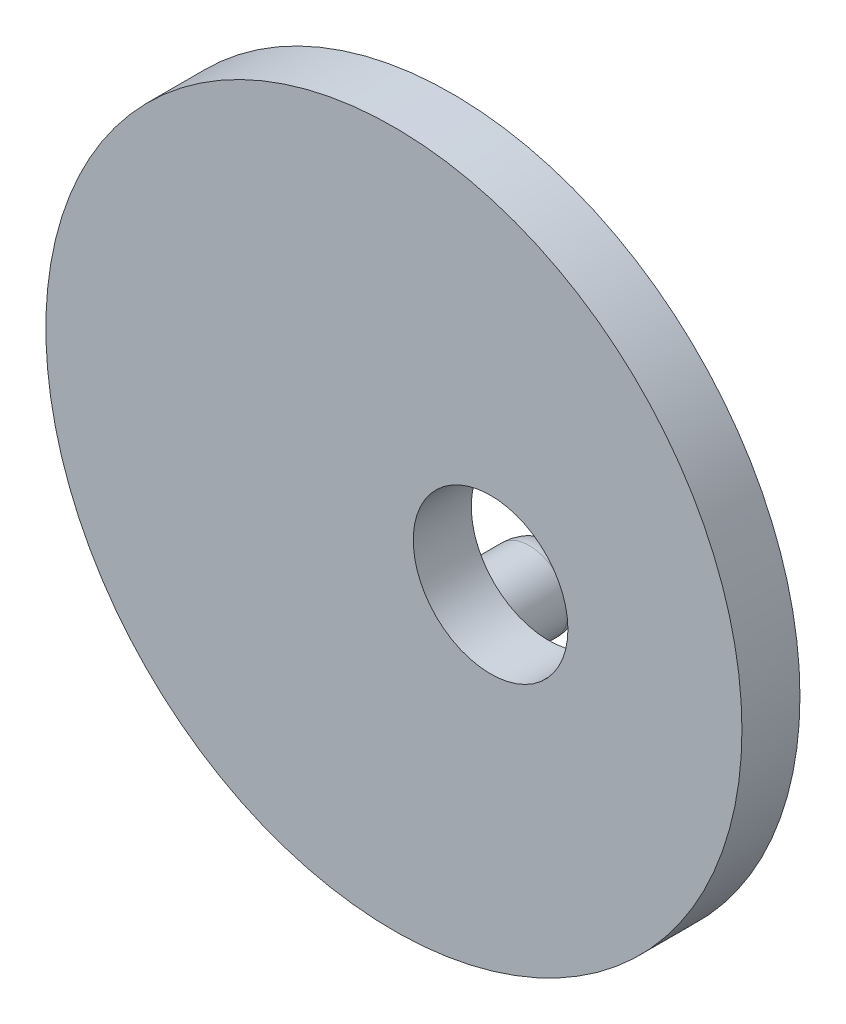
ISO-10303-21;
HEADER;
FILE_DESCRIPTION(('STEP AP214'),'2;1');
FILE_NAME('part.step','',(''),(''),'','','');
FILE_SCHEMA(('AUTOMOTIVE_DESIGN { 1 0 10303 214 1 1 1 1 }'));
ENDSEC;
DATA;
#1=APPLICATION_CONTEXT('core data for automotive mechanical design processes');
#2=APPLICATION_PROTOCOL_DEFINITION('international standard','automotive_design',2000,#1);
#3=PRODUCT_CONTEXT('',#1,'mechanical');
#4=PRODUCT('Part','Part','',(#3));
#5=PRODUCT_RELATED_PRODUCT_CATEGORY('part','',(#4));
#6=PRODUCT_DEFINITION_FORMATION('','',#4);
#7=PRODUCT_DEFINITION_CONTEXT('part definition',#1,'design');
#8=PRODUCT_DEFINITION('design','',#6,#7);
#9=PRODUCT_DEFINITION_SHAPE('','',#8);
#10=(LENGTH_UNIT() NAMED_UNIT(*) SI_UNIT(.MILLI.,.METRE.));
#11=(NAMED_UNIT(*) PLANE_ANGLE_UNIT() SI_UNIT($,.RADIAN.));
#12=(NAMED_UNIT(*) SI_UNIT($,.STERADIAN.) SOLID_ANGLE_UNIT());
#13=UNCERTAINTY_MEASURE_WITH_UNIT(LENGTH_MEASURE(1.E-05),#10,'distance_accuracy_value','');
#14=(GEOMETRIC_REPRESENTATION_CONTEXT(3) GLOBAL_UNCERTAINTY_ASSIGNED_CONTEXT((#13)) GLOBAL_UNIT_ASSIGNED_CONTEXT((#10,
#11,#12)) REPRESENTATION_CONTEXT('',''));
#15=CARTESIAN_POINT('',(0.,0.,0.));
#16=DIRECTION('',(0.,0.,1.));
#17=DIRECTION('',(1.,0.,0.));
#18=AXIS2_PLACEMENT_3D('',#15,#16,#17);
#19=CARTESIAN_POINT('',(2.5,0.,1.5));
#20=DIRECTION('',(0.,0.,-1.));
#21=DIRECTION('',(-1.,0.,0.));
#22=AXIS2_PLACEMENT_3D('',#19,#20,#21);
#23=CYLINDRICAL_SURFACE('',#22,2.);
#24=CARTESIAN_POINT('',(2.5,0.,1.5));
#25=DIRECTION('',(0.,0.,1.));
#26=DIRECTION('',(1.,0.,0.));
#27=AXIS2_PLACEMENT_3D('',#24,#25,#26);
#28=CIRCLE('',#27,2.);
#29=CARTESIAN_POINT('',(4.5,0.,1.5));
#30=VERTEX_POINT('',#29);
#31=EDGE_CURVE('E56',#30,#30,#28,.T.);
#32=ORIENTED_EDGE('',*,*,#31,.T.);
#33=EDGE_LOOP('',(#32));
#34=FACE_BOUND('',#33,.T.);
#35=CARTESIAN_POINT('',(2.5,0.,0.));
#36=DIRECTION('',(0.,0.,1.));
#37=DIRECTION('',(1.,0.,0.));
#38=AXIS2_PLACEMENT_3D('',#35,#36,#37);
#39=CIRCLE('',#38,2.);
#40=CARTESIAN_POINT('',(4.5,0.,0.));
#41=VERTEX_POINT('',#40);
#42=EDGE_CURVE('E62',#41,#41,#39,.T.);
#43=ORIENTED_EDGE('',*,*,#42,.F.);
#44=EDGE_LOOP('',(#43));
#45=FACE_BOUND('',#44,.T.);
#46=ADVANCED_FACE('F41',(#34,#45),#23,.F.);
#47=CARTESIAN_POINT('',(0.,0.,1.5));
#48=DIRECTION('',(0.,0.,-1.));
#49=DIRECTION('',(-1.,0.,0.));
#50=AXIS2_PLACEMENT_3D('',#47,#48,#49);
#51=CYLINDRICAL_SURFACE('',#50,9.);
#52=CARTESIAN_POINT('',(0.,0.,1.5));
#53=DIRECTION('',(0.,0.,1.));
#54=DIRECTION('',(1.,0.,0.));
#55=AXIS2_PLACEMENT_3D('',#52,#53,#54);
#56=CIRCLE('',#55,9.);
#57=CARTESIAN_POINT('',(9.,0.,1.5));
#58=VERTEX_POINT('',#57);
#59=EDGE_CURVE('E52',#58,#58,#56,.T.);
#60=ORIENTED_EDGE('',*,*,#59,.F.);
#61=EDGE_LOOP('',(#60));
#62=FACE_BOUND('',#61,.T.);
#63=CARTESIAN_POINT('',(0.,0.,0.));
#64=DIRECTION('',(0.,0.,1.));
#65=DIRECTION('',(1.,0.,0.));
#66=AXIS2_PLACEMENT_3D('',#63,#64,#65);
#67=CIRCLE('',#66,9.);
#68=CARTESIAN_POINT('',(9.,0.,0.));
#69=VERTEX_POINT('',#68);
#70=EDGE_CURVE('E59',#69,#69,#67,.T.);
#71=ORIENTED_EDGE('',*,*,#70,.T.);
#72=EDGE_LOOP('',(#71));
#73=FACE_BOUND('',#72,.T.);
#74=ADVANCED_FACE('F89',(#62,#73),#51,.T.);
#75=CARTESIAN_POINT('',(0.,0.,1.5));
#76=DIRECTION('',(0.,0.,1.));
#77=DIRECTION('',(1.,0.,0.));
#78=AXIS2_PLACEMENT_3D('',#75,#76,#77);
#79=PLANE('',#78);
#80=ORIENTED_EDGE('',*,*,#31,.F.);
#81=EDGE_LOOP('',(#80));
#82=FACE_BOUND('',#81,.T.);
#83=ORIENTED_EDGE('',*,*,#59,.T.);
#84=EDGE_LOOP('',(#83));
#85=FACE_BOUND('',#84,.T.);
#86=ADVANCED_FACE('F95',(#82,#85),#79,.T.);
#87=CARTESIAN_POINT('',(0.,0.,0.));
#88=DIRECTION('',(0.,0.,1.));
#89=DIRECTION('',(1.,0.,0.));
#90=AXIS2_PLACEMENT_3D('',#87,#88,#89);
#91=PLANE('',#90);
#92=CARTESIAN_POINT('',(-0.00151005416840465,3.12370741116681,0.));
#93=DIRECTION('',(0.,0.,1.));
#94=DIRECTION('',(1.,0.,0.));
#95=AXIS2_PLACEMENT_3D('',#92,#93,#94);
#96=CIRCLE('',#95,1.);
#97=CARTESIAN_POINT('',(0.998489945831597,3.12370741116681,0.));
#98=VERTEX_POINT('',#97);
#99=EDGE_CURVE('E70',#98,#98,#96,.T.);
#100=ORIENTED_EDGE('',*,*,#99,.T.);
#101=EDGE_LOOP('',(#100));
#102=FACE_BOUND('',#101,.T.);
#103=CARTESIAN_POINT('',(-0.00151005416840385,-3.1237074111668,0.));
#104=DIRECTION('',(0.,0.,1.));
#105=DIRECTION('',(1.,0.,0.));
#106=AXIS2_PLACEMENT_3D('',#103,#104,#105);
#107=CIRCLE('',#106,1.);
#108=CARTESIAN_POINT('',(0.998489945831598,-3.1237074111668,0.));
#109=VERTEX_POINT('',#108);
#110=EDGE_CURVE('E64',#109,#109,#107,.T.);
#111=ORIENTED_EDGE('',*,*,#110,.T.);
#112=EDGE_LOOP('',(#111));
#113=FACE_BOUND('',#112,.T.);
#114=ORIENTED_EDGE('',*,*,#42,.T.);
#115=EDGE_LOOP('',(#114));
#116=FACE_BOUND('',#115,.T.);
#117=ORIENTED_EDGE('',*,*,#70,.F.);
#118=EDGE_LOOP('',(#117));
#119=FACE_BOUND('',#118,.T.);
#120=ADVANCED_FACE('F74',(#102,#113,#116,#119),#91,.F.);
#121=CARTESIAN_POINT('',(-0.00151005416840385,-3.1237074111668,-3.));
#122=DIRECTION('',(0.,0.,1.));
#123=DIRECTION('',(1.,0.,0.));
#124=AXIS2_PLACEMENT_3D('',#121,#122,#123);
#125=CYLINDRICAL_SURFACE('',#124,1.);
#126=CARTESIAN_POINT('',(-0.00151005416840385,-3.1237074111668,-2.));
#127=DIRECTION('',(0.,0.,1.));
#128=DIRECTION('',(1.,0.,0.));
#129=AXIS2_PLACEMENT_3D('',#126,#127,#128);
#130=CIRCLE('',#129,1.);
#131=CARTESIAN_POINT('',(0.998489945831598,-3.1237074111668,-2.));
#132=VERTEX_POINT('',#131);
#133=EDGE_CURVE('E48',#132,#132,#130,.T.);
#134=ORIENTED_EDGE('',*,*,#133,.T.);
#135=EDGE_LOOP('',(#134));
#136=FACE_BOUND('',#135,.T.);
#137=ORIENTED_EDGE('',*,*,#110,.F.);
#138=EDGE_LOOP('',(#137));
#139=FACE_BOUND('',#138,.T.);
#140=ADVANCED_FACE('F80',(#136,#139),#125,.T.);
#141=CARTESIAN_POINT('',(-0.00151005416840465,3.12370741116681,-3.));
#142=DIRECTION('',(0.,0.,1.));
#143=DIRECTION('',(1.,0.,0.));
#144=AXIS2_PLACEMENT_3D('',#141,#142,#143);
#145=CYLINDRICAL_SURFACE('',#144,1.);
#146=CARTESIAN_POINT('',(-0.00151005416840465,3.12370741116681,-2.));
#147=DIRECTION('',(0.,0.,1.));
#148=DIRECTION('',(1.,0.,0.));
#149=AXIS2_PLACEMENT_3D('',#146,#147,#148);
#150=CIRCLE('',#149,1.);
#151=CARTESIAN_POINT('',(0.998489945831597,3.12370741116681,-2.));
#152=VERTEX_POINT('',#151);
#153=EDGE_CURVE('E10',#152,#152,#150,.T.);
#154=ORIENTED_EDGE('',*,*,#153,.T.);
#155=EDGE_LOOP('',(#154));
#156=FACE_BOUND('',#155,.T.);
#157=ORIENTED_EDGE('',*,*,#99,.F.);
#158=EDGE_LOOP('',(#157));
#159=FACE_BOUND('',#158,.T.);
#160=ADVANCED_FACE('F77',(#156,#159),#145,.T.);
#161=CARTESIAN_POINT('',(-0.00151005416840385,-3.1237074111668,-2.));
#162=DIRECTION('',(0.,0.,1.));
#163=DIRECTION('',(1.,0.,0.));
#164=AXIS2_PLACEMENT_3D('',#161,#162,#163);
#165=SPHERICAL_SURFACE('',#164,1.);
#166=ORIENTED_EDGE('',*,*,#133,.F.);
#167=EDGE_LOOP('',(#166));
#168=FACE_BOUND('',#167,.T.);
#169=ADVANCED_FACE('F79',(#168),#165,.T.);
#170=CARTESIAN_POINT('',(-0.00151005416840465,3.12370741116681,-2.));
#171=DIRECTION('',(0.,0.,1.));
#172=DIRECTION('',(1.,0.,0.));
#173=AXIS2_PLACEMENT_3D('',#170,#171,#172);
#174=SPHERICAL_SURFACE('',#173,1.);
#175=ORIENTED_EDGE('',*,*,#153,.F.);
#176=EDGE_LOOP('',(#175));
#177=FACE_BOUND('',#176,.T.);
#178=ADVANCED_FACE('F43',(#177),#174,.T.);
#179=CLOSED_SHELL('',(#46,#74,#86,#120,#140,#160,#169,#178));
#180=MANIFOLD_SOLID_BREP('B2',#179);
#181=ADVANCED_BREP_SHAPE_REPRESENTATION('',(#18,#180),#14);
#182=SHAPE_DEFINITION_REPRESENTATION(#9,#181);
ENDSEC;
END-ISO-10303-21;
